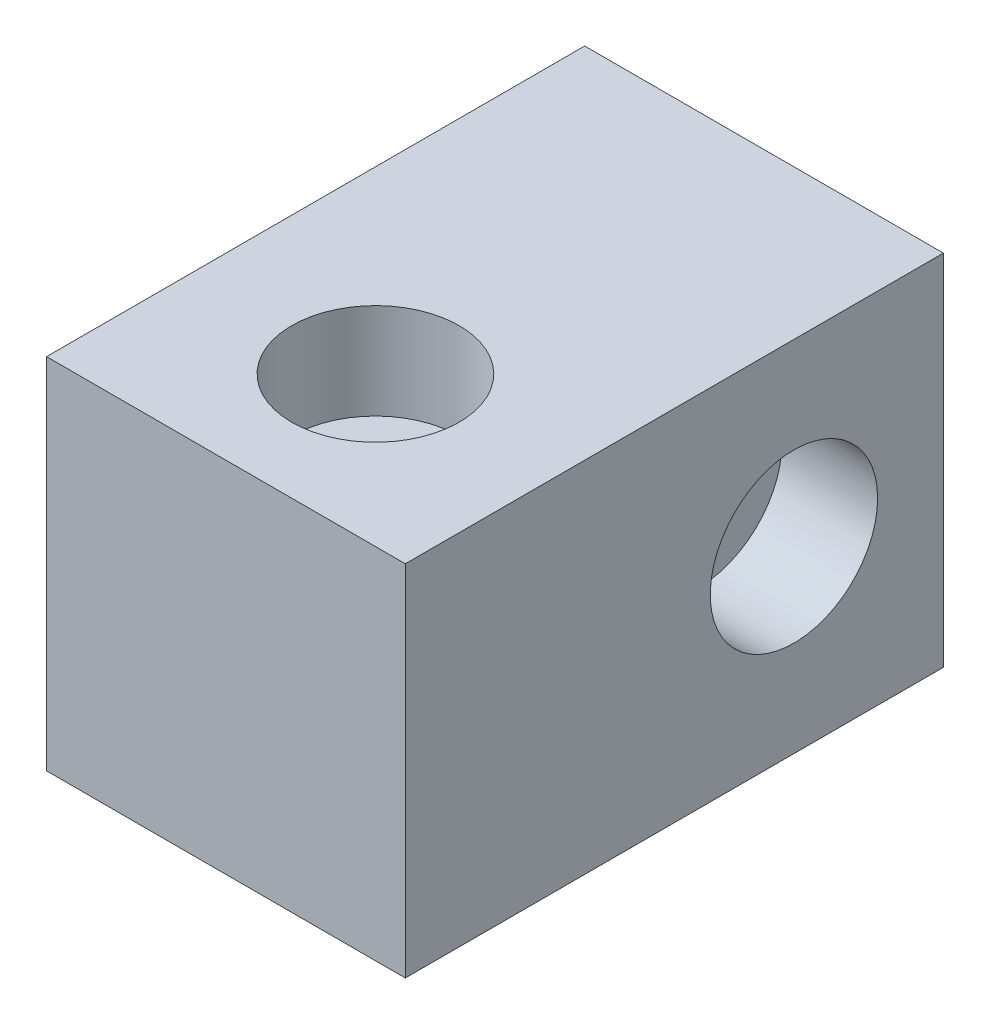
ISO-10303-21;
HEADER;
FILE_DESCRIPTION(('STEP AP214'),'2;1');
FILE_NAME('part.step','',(''),(''),'','','');
FILE_SCHEMA(('AUTOMOTIVE_DESIGN { 1 0 10303 214 1 1 1 1 }'));
ENDSEC;
DATA;
#1=APPLICATION_CONTEXT('core data for automotive mechanical design processes');
#2=APPLICATION_PROTOCOL_DEFINITION('international standard','automotive_design',2000,#1);
#3=PRODUCT_CONTEXT('',#1,'mechanical');
#4=PRODUCT('Part','Part','',(#3));
#5=PRODUCT_RELATED_PRODUCT_CATEGORY('part','',(#4));
#6=PRODUCT_DEFINITION_FORMATION('','',#4);
#7=PRODUCT_DEFINITION_CONTEXT('part definition',#1,'design');
#8=PRODUCT_DEFINITION('design','',#6,#7);
#9=PRODUCT_DEFINITION_SHAPE('','',#8);
#10=(LENGTH_UNIT() NAMED_UNIT(*) SI_UNIT(.MILLI.,.METRE.));
#11=(NAMED_UNIT(*) PLANE_ANGLE_UNIT() SI_UNIT($,.RADIAN.));
#12=(NAMED_UNIT(*) SI_UNIT($,.STERADIAN.) SOLID_ANGLE_UNIT());
#13=UNCERTAINTY_MEASURE_WITH_UNIT(LENGTH_MEASURE(1.E-05),#10,'distance_accuracy_value','');
#14=(GEOMETRIC_REPRESENTATION_CONTEXT(3) GLOBAL_UNCERTAINTY_ASSIGNED_CONTEXT((#13)) GLOBAL_UNIT_ASSIGNED_CONTEXT((#10,
#11,#12)) REPRESENTATION_CONTEXT('',''));
#15=CARTESIAN_POINT('',(0.,0.,0.));
#16=DIRECTION('',(0.,0.,1.));
#17=DIRECTION('',(1.,0.,0.));
#18=AXIS2_PLACEMENT_3D('',#15,#16,#17);
#19=CARTESIAN_POINT('',(15.,7.5,-16.25));
#20=DIRECTION('',(-1.,0.,0.));
#21=DIRECTION('',(0.,0.,1.));
#22=AXIS2_PLACEMENT_3D('',#19,#20,#21);
#23=CYLINDRICAL_SURFACE('',#22,2.);
#24=CARTESIAN_POINT('',(0.,7.5,-16.25));
#25=DIRECTION('',(-1.,0.,0.));
#26=DIRECTION('',(0.,0.,1.));
#27=AXIS2_PLACEMENT_3D('',#24,#25,#26);
#28=CIRCLE('',#27,2.);
#29=CARTESIAN_POINT('',(0.,7.5,-14.25));
#30=VERTEX_POINT('',#29);
#31=EDGE_CURVE('E110',#30,#30,#28,.T.);
#32=ORIENTED_EDGE('',*,*,#31,.T.);
#33=EDGE_LOOP('',(#32));
#34=FACE_BOUND('',#33,.T.);
#35=CARTESIAN_POINT('',(11.,7.5,-16.25));
#36=DIRECTION('',(1.,0.,0.));
#37=DIRECTION('',(0.,0.,-1.));
#38=AXIS2_PLACEMENT_3D('',#35,#36,#37);
#39=CIRCLE('',#38,2.);
#40=CARTESIAN_POINT('',(11.,7.5,-18.25));
#41=VERTEX_POINT('',#40);
#42=EDGE_CURVE('E37',#41,#41,#39,.F.);
#43=ORIENTED_EDGE('',*,*,#42,.F.);
#44=EDGE_LOOP('',(#43));
#45=FACE_BOUND('',#44,.T.);
#46=ADVANCED_FACE('F33',(#34,#45),#23,.F.);
#47=CARTESIAN_POINT('',(7.5,0.,-6.25));
#48=DIRECTION('',(0.,1.,0.));
#49=DIRECTION('',(0.,0.,1.));
#50=AXIS2_PLACEMENT_3D('',#47,#48,#49);
#51=CYLINDRICAL_SURFACE('',#50,2.);
#52=CARTESIAN_POINT('',(7.5,0.,-6.25));
#53=DIRECTION('',(0.,1.,0.));
#54=DIRECTION('',(0.,0.,1.));
#55=AXIS2_PLACEMENT_3D('',#52,#53,#54);
#56=CIRCLE('',#55,2.);
#57=CARTESIAN_POINT('',(7.5,0.,-4.25));
#58=VERTEX_POINT('',#57);
#59=EDGE_CURVE('E103',#58,#58,#56,.T.);
#60=ORIENTED_EDGE('',*,*,#59,.F.);
#61=EDGE_LOOP('',(#60));
#62=FACE_BOUND('',#61,.T.);
#63=CARTESIAN_POINT('',(7.5,11.,-6.25));
#64=DIRECTION('',(0.,1.,0.));
#65=DIRECTION('',(0.,0.,1.));
#66=AXIS2_PLACEMENT_3D('',#63,#64,#65);
#67=CIRCLE('',#66,2.);
#68=CARTESIAN_POINT('',(7.5,11.,-4.25));
#69=VERTEX_POINT('',#68);
#70=EDGE_CURVE('E108',#69,#69,#67,.F.);
#71=ORIENTED_EDGE('',*,*,#70,.F.);
#72=EDGE_LOOP('',(#71));
#73=FACE_BOUND('',#72,.T.);
#74=ADVANCED_FACE('F133',(#62,#73),#51,.F.);
#75=CARTESIAN_POINT('',(0.,15.,0.));
#76=DIRECTION('',(1.,0.,0.));
#77=DIRECTION('',(0.,0.,-1.));
#78=AXIS2_PLACEMENT_3D('',#75,#76,#77);
#79=PLANE('',#78);
#80=ORIENTED_EDGE('',*,*,#31,.F.);
#81=EDGE_LOOP('',(#80));
#82=FACE_BOUND('',#81,.T.);
#83=DIRECTION('',(0.,0.,1.));
#84=VECTOR('',#83,1.);
#85=CARTESIAN_POINT('',(0.,0.,0.));
#86=LINE('',#85,#84);
#87=CARTESIAN_POINT('',(0.,0.,-22.5));
#88=VERTEX_POINT('',#87);
#89=CARTESIAN_POINT('',(0.,0.,0.));
#90=VERTEX_POINT('',#89);
#91=EDGE_CURVE('E100',#88,#90,#86,.T.);
#92=ORIENTED_EDGE('',*,*,#91,.T.);
#93=DIRECTION('',(0.,-1.,0.));
#94=VECTOR('',#93,1.);
#95=CARTESIAN_POINT('',(0.,15.,0.));
#96=LINE('',#95,#94);
#97=CARTESIAN_POINT('',(0.,15.,0.));
#98=VERTEX_POINT('',#97);
#99=EDGE_CURVE('E11',#98,#90,#96,.T.);
#100=ORIENTED_EDGE('',*,*,#99,.F.);
#101=DIRECTION('',(0.,0.,1.));
#102=VECTOR('',#101,1.);
#103=CARTESIAN_POINT('',(0.,15.,0.));
#104=LINE('',#103,#102);
#105=CARTESIAN_POINT('',(0.,15.,-22.5));
#106=VERTEX_POINT('',#105);
#107=EDGE_CURVE('E87',#106,#98,#104,.T.);
#108=ORIENTED_EDGE('',*,*,#107,.F.);
#109=DIRECTION('',(0.,-1.,0.));
#110=VECTOR('',#109,1.);
#111=CARTESIAN_POINT('',(0.,15.,-22.5));
#112=LINE('',#111,#110);
#113=EDGE_CURVE('E96',#106,#88,#112,.T.);
#114=ORIENTED_EDGE('',*,*,#113,.T.);
#115=EDGE_LOOP('',(#92,#100,#108,#114));
#116=FACE_BOUND('',#115,.T.);
#117=ADVANCED_FACE('F35',(#82,#116),#79,.F.);
#118=CARTESIAN_POINT('',(0.,15.,0.));
#119=DIRECTION('',(0.,0.,-1.));
#120=DIRECTION('',(-1.,0.,0.));
#121=AXIS2_PLACEMENT_3D('',#118,#119,#120);
#122=PLANE('',#121);
#123=DIRECTION('',(1.,0.,0.));
#124=VECTOR('',#123,1.);
#125=CARTESIAN_POINT('',(0.,0.,0.));
#126=LINE('',#125,#124);
#127=CARTESIAN_POINT('',(15.,0.,0.));
#128=VERTEX_POINT('',#127);
#129=EDGE_CURVE('E91',#90,#128,#126,.T.);
#130=ORIENTED_EDGE('',*,*,#129,.T.);
#131=DIRECTION('',(0.,-1.,0.));
#132=VECTOR('',#131,1.);
#133=CARTESIAN_POINT('',(15.,15.,0.));
#134=LINE('',#133,#132);
#135=CARTESIAN_POINT('',(15.,15.,0.));
#136=VERTEX_POINT('',#135);
#137=EDGE_CURVE('E43',#136,#128,#134,.T.);
#138=ORIENTED_EDGE('',*,*,#137,.F.);
#139=DIRECTION('',(1.,0.,0.));
#140=VECTOR('',#139,1.);
#141=CARTESIAN_POINT('',(0.,15.,0.));
#142=LINE('',#141,#140);
#143=EDGE_CURVE('E82',#98,#136,#142,.T.);
#144=ORIENTED_EDGE('',*,*,#143,.F.);
#145=ORIENTED_EDGE('',*,*,#99,.T.);
#146=EDGE_LOOP('',(#130,#138,#144,#145));
#147=FACE_BOUND('',#146,.T.);
#148=ADVANCED_FACE('F90',(#147),#122,.F.);
#149=CARTESIAN_POINT('',(15.,15.,0.));
#150=DIRECTION('',(-1.,0.,0.));
#151=DIRECTION('',(0.,0.,1.));
#152=AXIS2_PLACEMENT_3D('',#149,#150,#151);
#153=PLANE('',#152);
#154=CARTESIAN_POINT('',(15.,7.5,-16.25));
#155=DIRECTION('',(1.,0.,0.));
#156=DIRECTION('',(0.,0.,-1.));
#157=AXIS2_PLACEMENT_3D('',#154,#155,#156);
#158=CIRCLE('',#157,3.5);
#159=CARTESIAN_POINT('',(15.,7.5,-19.75));
#160=VERTEX_POINT('',#159);
#161=EDGE_CURVE('E124',#160,#160,#158,.T.);
#162=ORIENTED_EDGE('',*,*,#161,.F.);
#163=EDGE_LOOP('',(#162));
#164=FACE_BOUND('',#163,.T.);
#165=DIRECTION('',(0.,0.,-1.));
#166=VECTOR('',#165,1.);
#167=CARTESIAN_POINT('',(15.,0.,0.));
#168=LINE('',#167,#166);
#169=CARTESIAN_POINT('',(15.,0.,-22.5));
#170=VERTEX_POINT('',#169);
#171=EDGE_CURVE('E69',#128,#170,#168,.T.);
#172=ORIENTED_EDGE('',*,*,#171,.T.);
#173=DIRECTION('',(0.,-1.,0.));
#174=VECTOR('',#173,1.);
#175=CARTESIAN_POINT('',(15.,15.,-22.5));
#176=LINE('',#175,#174);
#177=CARTESIAN_POINT('',(15.,15.,-22.5));
#178=VERTEX_POINT('',#177);
#179=EDGE_CURVE('E92',#178,#170,#176,.T.);
#180=ORIENTED_EDGE('',*,*,#179,.F.);
#181=DIRECTION('',(0.,0.,-1.));
#182=VECTOR('',#181,1.);
#183=CARTESIAN_POINT('',(15.,15.,0.));
#184=LINE('',#183,#182);
#185=EDGE_CURVE('E85',#136,#178,#184,.T.);
#186=ORIENTED_EDGE('',*,*,#185,.F.);
#187=ORIENTED_EDGE('',*,*,#137,.T.);
#188=EDGE_LOOP('',(#172,#180,#186,#187));
#189=FACE_BOUND('',#188,.T.);
#190=ADVANCED_FACE('F94',(#164,#189),#153,.F.);
#191=CARTESIAN_POINT('',(0.,15.,-22.5));
#192=DIRECTION('',(0.,0.,1.));
#193=DIRECTION('',(1.,0.,0.));
#194=AXIS2_PLACEMENT_3D('',#191,#192,#193);
#195=PLANE('',#194);
#196=DIRECTION('',(-1.,0.,0.));
#197=VECTOR('',#196,1.);
#198=CARTESIAN_POINT('',(0.,0.,-22.5));
#199=LINE('',#198,#197);
#200=EDGE_CURVE('E75',#170,#88,#199,.T.);
#201=ORIENTED_EDGE('',*,*,#200,.T.);
#202=ORIENTED_EDGE('',*,*,#113,.F.);
#203=DIRECTION('',(-1.,0.,0.));
#204=VECTOR('',#203,1.);
#205=CARTESIAN_POINT('',(0.,15.,-22.5));
#206=LINE('',#205,#204);
#207=EDGE_CURVE('E52',#178,#106,#206,.T.);
#208=ORIENTED_EDGE('',*,*,#207,.F.);
#209=ORIENTED_EDGE('',*,*,#179,.T.);
#210=EDGE_LOOP('',(#201,#202,#208,#209));
#211=FACE_BOUND('',#210,.T.);
#212=ADVANCED_FACE('F149',(#211),#195,.F.);
#213=CARTESIAN_POINT('',(0.,15.,0.));
#214=DIRECTION('',(0.,-1.,0.));
#215=DIRECTION('',(0.,0.,-1.));
#216=AXIS2_PLACEMENT_3D('',#213,#214,#215);
#217=PLANE('',#216);
#218=CARTESIAN_POINT('',(7.5,15.,-6.25));
#219=DIRECTION('',(0.,1.,0.));
#220=DIRECTION('',(0.,0.,1.));
#221=AXIS2_PLACEMENT_3D('',#218,#219,#220);
#222=CIRCLE('',#221,3.5);
#223=CARTESIAN_POINT('',(7.5,15.,-2.75));
#224=VERTEX_POINT('',#223);
#225=EDGE_CURVE('E117',#224,#224,#222,.T.);
#226=ORIENTED_EDGE('',*,*,#225,.F.);
#227=EDGE_LOOP('',(#226));
#228=FACE_BOUND('',#227,.T.);
#229=ORIENTED_EDGE('',*,*,#107,.T.);
#230=ORIENTED_EDGE('',*,*,#143,.T.);
#231=ORIENTED_EDGE('',*,*,#185,.T.);
#232=ORIENTED_EDGE('',*,*,#207,.T.);
#233=EDGE_LOOP('',(#229,#230,#231,#232));
#234=FACE_BOUND('',#233,.T.);
#235=ADVANCED_FACE('F83',(#228,#234),#217,.F.);
#236=CARTESIAN_POINT('',(0.,0.,0.));
#237=DIRECTION('',(0.,-1.,0.));
#238=DIRECTION('',(0.,0.,-1.));
#239=AXIS2_PLACEMENT_3D('',#236,#237,#238);
#240=PLANE('',#239);
#241=ORIENTED_EDGE('',*,*,#59,.T.);
#242=EDGE_LOOP('',(#241));
#243=FACE_BOUND('',#242,.T.);
#244=ORIENTED_EDGE('',*,*,#91,.F.);
#245=ORIENTED_EDGE('',*,*,#200,.F.);
#246=ORIENTED_EDGE('',*,*,#171,.F.);
#247=ORIENTED_EDGE('',*,*,#129,.F.);
#248=EDGE_LOOP('',(#244,#245,#246,#247));
#249=FACE_BOUND('',#248,.T.);
#250=ADVANCED_FACE('F130',(#243,#249),#240,.T.);
#251=CARTESIAN_POINT('',(7.5,11.,-6.25));
#252=DIRECTION('',(0.,1.,0.));
#253=DIRECTION('',(0.,0.,1.));
#254=AXIS2_PLACEMENT_3D('',#251,#252,#253);
#255=PLANE('',#254);
#256=CARTESIAN_POINT('',(7.5,11.,-6.25));
#257=DIRECTION('',(0.,1.,0.));
#258=DIRECTION('',(0.,0.,1.));
#259=AXIS2_PLACEMENT_3D('',#256,#257,#258);
#260=CIRCLE('',#259,3.5);
#261=CARTESIAN_POINT('',(7.5,11.,-2.75));
#262=VERTEX_POINT('',#261);
#263=EDGE_CURVE('E111',#262,#262,#260,.T.);
#264=ORIENTED_EDGE('',*,*,#263,.T.);
#265=EDGE_LOOP('',(#264));
#266=FACE_BOUND('',#265,.T.);
#267=ORIENTED_EDGE('',*,*,#70,.T.);
#268=EDGE_LOOP('',(#267));
#269=FACE_BOUND('',#268,.T.);
#270=ADVANCED_FACE('F153',(#266,#269),#255,.T.);
#271=CARTESIAN_POINT('',(7.5,11.,-6.25));
#272=DIRECTION('',(0.,1.,0.));
#273=DIRECTION('',(0.,0.,1.));
#274=AXIS2_PLACEMENT_3D('',#271,#272,#273);
#275=CYLINDRICAL_SURFACE('',#274,3.5);
#276=ORIENTED_EDGE('',*,*,#263,.F.);
#277=EDGE_LOOP('',(#276));
#278=FACE_BOUND('',#277,.T.);
#279=ORIENTED_EDGE('',*,*,#225,.T.);
#280=EDGE_LOOP('',(#279));
#281=FACE_BOUND('',#280,.T.);
#282=ADVANCED_FACE('F201',(#278,#281),#275,.F.);
#283=CARTESIAN_POINT('',(11.,7.5,-16.25));
#284=DIRECTION('',(1.,0.,0.));
#285=DIRECTION('',(0.,0.,-1.));
#286=AXIS2_PLACEMENT_3D('',#283,#284,#285);
#287=PLANE('',#286);
#288=CARTESIAN_POINT('',(11.,7.5,-16.25));
#289=DIRECTION('',(1.,0.,0.));
#290=DIRECTION('',(0.,0.,-1.));
#291=AXIS2_PLACEMENT_3D('',#288,#289,#290);
#292=CIRCLE('',#291,3.5);
#293=CARTESIAN_POINT('',(11.,7.5,-19.75));
#294=VERTEX_POINT('',#293);
#295=EDGE_CURVE('E229',#294,#294,#292,.T.);
#296=ORIENTED_EDGE('',*,*,#295,.T.);
#297=EDGE_LOOP('',(#296));
#298=FACE_BOUND('',#297,.T.);
#299=ORIENTED_EDGE('',*,*,#42,.T.);
#300=EDGE_LOOP('',(#299));
#301=FACE_BOUND('',#300,.T.);
#302=ADVANCED_FACE('F207',(#298,#301),#287,.T.);
#303=CARTESIAN_POINT('',(11.,7.5,-16.25));
#304=DIRECTION('',(1.,0.,0.));
#305=DIRECTION('',(0.,0.,-1.));
#306=AXIS2_PLACEMENT_3D('',#303,#304,#305);
#307=CYLINDRICAL_SURFACE('',#306,3.5);
#308=ORIENTED_EDGE('',*,*,#295,.F.);
#309=EDGE_LOOP('',(#308));
#310=FACE_BOUND('',#309,.T.);
#311=ORIENTED_EDGE('',*,*,#161,.T.);
#312=EDGE_LOOP('',(#311));
#313=FACE_BOUND('',#312,.T.);
#314=ADVANCED_FACE('F212',(#310,#313),#307,.F.);
#315=CLOSED_SHELL('',(#46,#74,#117,#148,#190,#212,#235,#250,#270,#282,#302,#314));
#316=MANIFOLD_SOLID_BREP('B2',#315);
#317=ADVANCED_BREP_SHAPE_REPRESENTATION('',(#18,#316),#14);
#318=SHAPE_DEFINITION_REPRESENTATION(#9,#317);
ENDSEC;
END-ISO-10303-21;
